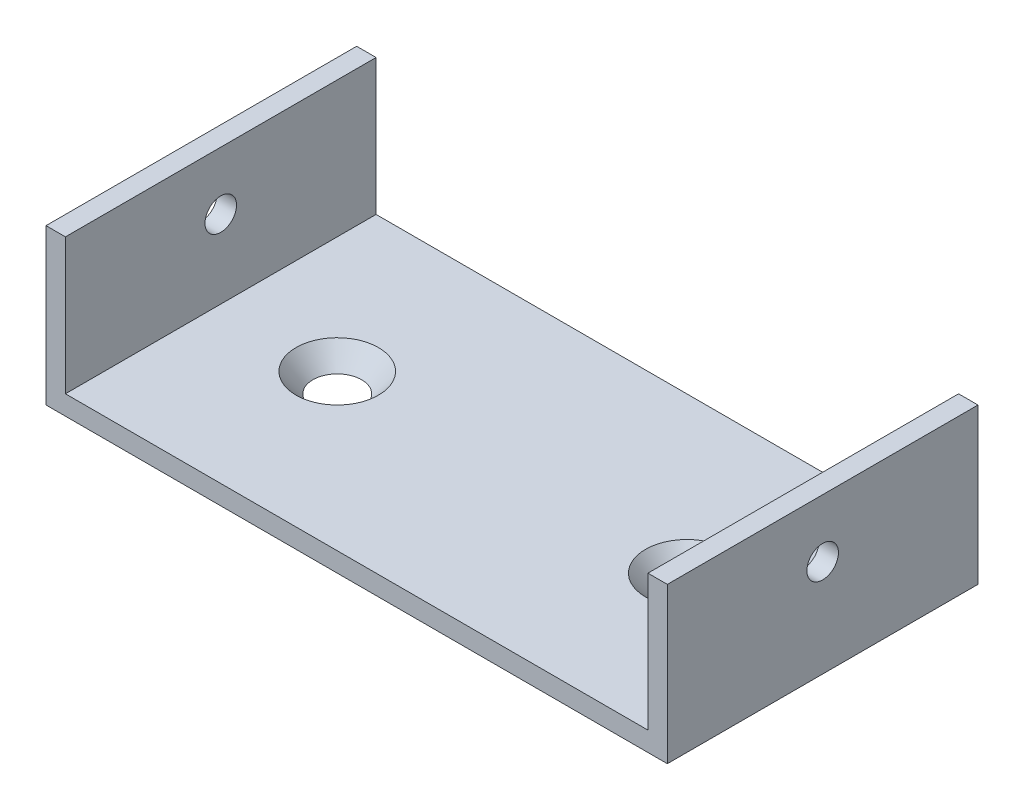
ISO-10303-21;
HEADER;
FILE_DESCRIPTION(('STEP AP214'),'2;1');
FILE_NAME('part.step','',(''),(''),'','','');
FILE_SCHEMA(('AUTOMOTIVE_DESIGN { 1 0 10303 214 1 1 1 1 }'));
ENDSEC;
DATA;
#1=APPLICATION_CONTEXT('core data for automotive mechanical design processes');
#2=APPLICATION_PROTOCOL_DEFINITION('international standard','automotive_design',2000,#1);
#3=PRODUCT_CONTEXT('',#1,'mechanical');
#4=PRODUCT('Part','Part','',(#3));
#5=PRODUCT_RELATED_PRODUCT_CATEGORY('part','',(#4));
#6=PRODUCT_DEFINITION_FORMATION('','',#4);
#7=PRODUCT_DEFINITION_CONTEXT('part definition',#1,'design');
#8=PRODUCT_DEFINITION('design','',#6,#7);
#9=PRODUCT_DEFINITION_SHAPE('','',#8);
#10=(LENGTH_UNIT() NAMED_UNIT(*) SI_UNIT(.MILLI.,.METRE.));
#11=(NAMED_UNIT(*) PLANE_ANGLE_UNIT() SI_UNIT($,.RADIAN.));
#12=(NAMED_UNIT(*) SI_UNIT($,.STERADIAN.) SOLID_ANGLE_UNIT());
#13=UNCERTAINTY_MEASURE_WITH_UNIT(LENGTH_MEASURE(1.E-05),#10,'distance_accuracy_value','');
#14=(GEOMETRIC_REPRESENTATION_CONTEXT(3) GLOBAL_UNCERTAINTY_ASSIGNED_CONTEXT((#13)) GLOBAL_UNIT_ASSIGNED_CONTEXT((#10,
#11,#12)) REPRESENTATION_CONTEXT('',''));
#15=CARTESIAN_POINT('',(0.,0.,0.));
#16=DIRECTION('',(0.,0.,1.));
#17=DIRECTION('',(1.,0.,0.));
#18=AXIS2_PLACEMENT_3D('',#15,#16,#17);
#19=CARTESIAN_POINT('',(-50.8,-12.7,25.4));
#20=DIRECTION('',(0.,1.,0.));
#21=DIRECTION('',(0.,0.,1.));
#22=AXIS2_PLACEMENT_3D('',#19,#20,#21);
#23=PLANE('',#22);
#24=CARTESIAN_POINT('',(-28.575,-12.7,0.));
#25=DIRECTION('',(0.,1.,0.));
#26=DIRECTION('',(0.,0.,1.));
#27=AXIS2_PLACEMENT_3D('',#24,#25,#26);
#28=CIRCLE('',#27,3.98371460743348);
#29=CARTESIAN_POINT('',(-28.575,-12.7,3.98371460743348));
#30=VERTEX_POINT('',#29);
#31=EDGE_CURVE('E47',#30,#30,#28,.T.);
#32=ORIENTED_EDGE('',*,*,#31,.T.);
#33=EDGE_LOOP('',(#32));
#34=FACE_BOUND('',#33,.T.);
#35=CARTESIAN_POINT('',(28.575,-12.7,0.));
#36=DIRECTION('',(0.,1.,0.));
#37=DIRECTION('',(0.,0.,1.));
#38=AXIS2_PLACEMENT_3D('',#35,#36,#37);
#39=CIRCLE('',#38,3.98371460743347);
#40=CARTESIAN_POINT('',(28.575,-12.7,3.98371460743348));
#41=VERTEX_POINT('',#40);
#42=EDGE_CURVE('E152',#41,#41,#39,.T.);
#43=ORIENTED_EDGE('',*,*,#42,.T.);
#44=EDGE_LOOP('',(#43));
#45=FACE_BOUND('',#44,.T.);
#46=DIRECTION('',(1.,0.,0.));
#47=VECTOR('',#46,1.);
#48=CARTESIAN_POINT('',(-50.8,-12.7,-25.4));
#49=LINE('',#48,#47);
#50=CARTESIAN_POINT('',(-50.8,-12.7,-25.4));
#51=VERTEX_POINT('',#50);
#52=CARTESIAN_POINT('',(50.8,-12.7,-25.4));
#53=VERTEX_POINT('',#52);
#54=EDGE_CURVE('E155',#51,#53,#49,.T.);
#55=ORIENTED_EDGE('',*,*,#54,.T.);
#56=DIRECTION('',(0.,0.,-1.));
#57=VECTOR('',#56,1.);
#58=CARTESIAN_POINT('',(50.8,-12.7,25.4));
#59=LINE('',#58,#57);
#60=CARTESIAN_POINT('',(50.8,-12.7,25.4));
#61=VERTEX_POINT('',#60);
#62=EDGE_CURVE('E181',#61,#53,#59,.T.);
#63=ORIENTED_EDGE('',*,*,#62,.F.);
#64=DIRECTION('',(1.,0.,0.));
#65=VECTOR('',#64,1.);
#66=CARTESIAN_POINT('',(-50.8,-12.7,25.4));
#67=LINE('',#66,#65);
#68=CARTESIAN_POINT('',(-50.8,-12.7,25.4));
#69=VERTEX_POINT('',#68);
#70=EDGE_CURVE('E207',#69,#61,#67,.T.);
#71=ORIENTED_EDGE('',*,*,#70,.F.);
#72=DIRECTION('',(0.,0.,-1.));
#73=VECTOR('',#72,1.);
#74=CARTESIAN_POINT('',(-50.8,-12.7,25.4));
#75=LINE('',#74,#73);
#76=EDGE_CURVE('E54',#69,#51,#75,.T.);
#77=ORIENTED_EDGE('',*,*,#76,.T.);
#78=EDGE_LOOP('',(#55,#63,#71,#77));
#79=FACE_BOUND('',#78,.T.);
#80=ADVANCED_FACE('F43',(#34,#45,#79),#23,.F.);
#81=CARTESIAN_POINT('',(-47.625,12.7,25.4));
#82=DIRECTION('',(0.,-1.,0.));
#83=DIRECTION('',(1.,0.,0.));
#84=AXIS2_PLACEMENT_3D('',#81,#82,#83);
#85=PLANE('',#84);
#86=DIRECTION('',(-1.,0.,0.));
#87=VECTOR('',#86,1.);
#88=CARTESIAN_POINT('',(-47.625,12.7,-25.4));
#89=LINE('',#88,#87);
#90=CARTESIAN_POINT('',(-47.625,12.7,-25.4));
#91=VERTEX_POINT('',#90);
#92=CARTESIAN_POINT('',(-50.8,12.7,-25.4));
#93=VERTEX_POINT('',#92);
#94=EDGE_CURVE('E147',#91,#93,#89,.T.);
#95=ORIENTED_EDGE('',*,*,#94,.T.);
#96=DIRECTION('',(0.,0.,-1.));
#97=VECTOR('',#96,1.);
#98=CARTESIAN_POINT('',(-50.8,12.7,25.4));
#99=LINE('',#98,#97);
#100=CARTESIAN_POINT('',(-50.8,12.7,25.4));
#101=VERTEX_POINT('',#100);
#102=EDGE_CURVE('E11',#101,#93,#99,.T.);
#103=ORIENTED_EDGE('',*,*,#102,.F.);
#104=DIRECTION('',(-1.,0.,0.));
#105=VECTOR('',#104,1.);
#106=CARTESIAN_POINT('',(-47.625,12.7,25.4));
#107=LINE('',#106,#105);
#108=CARTESIAN_POINT('',(-47.625,12.7,25.4));
#109=VERTEX_POINT('',#108);
#110=EDGE_CURVE('E170',#109,#101,#107,.T.);
#111=ORIENTED_EDGE('',*,*,#110,.F.);
#112=DIRECTION('',(0.,0.,-1.));
#113=VECTOR('',#112,1.);
#114=CARTESIAN_POINT('',(-47.625,12.7,25.4));
#115=LINE('',#114,#113);
#116=EDGE_CURVE('E143',#109,#91,#115,.T.);
#117=ORIENTED_EDGE('',*,*,#116,.T.);
#118=EDGE_LOOP('',(#95,#103,#111,#117));
#119=FACE_BOUND('',#118,.T.);
#120=ADVANCED_FACE('F45',(#119),#85,.F.);
#121=CARTESIAN_POINT('',(-50.8,12.7,25.4));
#122=DIRECTION('',(1.,0.,0.));
#123=DIRECTION('',(0.,0.,-1.));
#124=AXIS2_PLACEMENT_3D('',#121,#122,#123);
#125=PLANE('',#124);
#126=CARTESIAN_POINT('',(-50.8,3.21584337728158,0.));
#127=DIRECTION('',(1.,0.,0.));
#128=DIRECTION('',(0.,0.,-1.));
#129=AXIS2_PLACEMENT_3D('',#126,#127,#128);
#130=CIRCLE('',#129,2.57975099999998);
#131=CARTESIAN_POINT('',(-50.8,3.21584337728158,-2.57975099999998));
#132=VERTEX_POINT('',#131);
#133=EDGE_CURVE('E260',#132,#132,#130,.T.);
#134=ORIENTED_EDGE('',*,*,#133,.T.);
#135=EDGE_LOOP('',(#134));
#136=FACE_BOUND('',#135,.T.);
#137=DIRECTION('',(0.,-1.,0.));
#138=VECTOR('',#137,1.);
#139=CARTESIAN_POINT('',(-50.8,12.7,-25.4));
#140=LINE('',#139,#138);
#141=EDGE_CURVE('E151',#93,#51,#140,.T.);
#142=ORIENTED_EDGE('',*,*,#141,.T.);
#143=ORIENTED_EDGE('',*,*,#76,.F.);
#144=DIRECTION('',(0.,-1.,0.));
#145=VECTOR('',#144,1.);
#146=CARTESIAN_POINT('',(-50.8,12.7,25.4));
#147=LINE('',#146,#145);
#148=EDGE_CURVE('E106',#101,#69,#147,.T.);
#149=ORIENTED_EDGE('',*,*,#148,.F.);
#150=ORIENTED_EDGE('',*,*,#102,.T.);
#151=EDGE_LOOP('',(#142,#143,#149,#150));
#152=FACE_BOUND('',#151,.T.);
#153=ADVANCED_FACE('F249',(#136,#152),#125,.F.);
#154=CARTESIAN_POINT('',(50.8,-12.7,25.4));
#155=DIRECTION('',(-1.,0.,0.));
#156=DIRECTION('',(0.,0.,1.));
#157=AXIS2_PLACEMENT_3D('',#154,#155,#156);
#158=PLANE('',#157);
#159=CARTESIAN_POINT('',(50.8,3.21584337728158,0.));
#160=DIRECTION('',(1.,0.,0.));
#161=DIRECTION('',(0.,0.,-1.));
#162=AXIS2_PLACEMENT_3D('',#159,#160,#161);
#163=CIRCLE('',#162,2.57975099999999);
#164=CARTESIAN_POINT('',(50.8,3.21584337728158,-2.57975099999999));
#165=VERTEX_POINT('',#164);
#166=EDGE_CURVE('E265',#165,#165,#163,.T.);
#167=ORIENTED_EDGE('',*,*,#166,.F.);
#168=EDGE_LOOP('',(#167));
#169=FACE_BOUND('',#168,.T.);
#170=DIRECTION('',(0.,1.,0.));
#171=VECTOR('',#170,1.);
#172=CARTESIAN_POINT('',(50.8,-12.7,-25.4));
#173=LINE('',#172,#171);
#174=CARTESIAN_POINT('',(50.8,12.7,-25.4));
#175=VERTEX_POINT('',#174);
#176=EDGE_CURVE('E158',#53,#175,#173,.T.);
#177=ORIENTED_EDGE('',*,*,#176,.T.);
#178=DIRECTION('',(0.,0.,-1.));
#179=VECTOR('',#178,1.);
#180=CARTESIAN_POINT('',(50.8,12.7,25.4));
#181=LINE('',#180,#179);
#182=CARTESIAN_POINT('',(50.8,12.7,25.4));
#183=VERTEX_POINT('',#182);
#184=EDGE_CURVE('E177',#183,#175,#181,.T.);
#185=ORIENTED_EDGE('',*,*,#184,.F.);
#186=DIRECTION('',(0.,1.,0.));
#187=VECTOR('',#186,1.);
#188=CARTESIAN_POINT('',(50.8,-12.7,25.4));
#189=LINE('',#188,#187);
#190=EDGE_CURVE('E210',#61,#183,#189,.T.);
#191=ORIENTED_EDGE('',*,*,#190,.F.);
#192=ORIENTED_EDGE('',*,*,#62,.T.);
#193=EDGE_LOOP('',(#177,#185,#191,#192));
#194=FACE_BOUND('',#193,.T.);
#195=ADVANCED_FACE('F218',(#169,#194),#158,.F.);
#196=CARTESIAN_POINT('',(50.8,12.7,25.4));
#197=DIRECTION('',(0.,-1.,0.));
#198=DIRECTION('',(1.,0.,0.));
#199=AXIS2_PLACEMENT_3D('',#196,#197,#198);
#200=PLANE('',#199);
#201=DIRECTION('',(-1.,0.,0.));
#202=VECTOR('',#201,1.);
#203=CARTESIAN_POINT('',(50.8,12.7,-25.4));
#204=LINE('',#203,#202);
#205=CARTESIAN_POINT('',(47.625,12.7,-25.4));
#206=VERTEX_POINT('',#205);
#207=EDGE_CURVE('E161',#175,#206,#204,.T.);
#208=ORIENTED_EDGE('',*,*,#207,.T.);
#209=DIRECTION('',(0.,0.,-1.));
#210=VECTOR('',#209,1.);
#211=CARTESIAN_POINT('',(47.625,12.7,25.4));
#212=LINE('',#211,#210);
#213=CARTESIAN_POINT('',(47.625,12.7,25.4));
#214=VERTEX_POINT('',#213);
#215=EDGE_CURVE('E136',#214,#206,#212,.T.);
#216=ORIENTED_EDGE('',*,*,#215,.F.);
#217=DIRECTION('',(-1.,0.,0.));
#218=VECTOR('',#217,1.);
#219=CARTESIAN_POINT('',(50.8,12.7,25.4));
#220=LINE('',#219,#218);
#221=EDGE_CURVE('E125',#183,#214,#220,.T.);
#222=ORIENTED_EDGE('',*,*,#221,.F.);
#223=ORIENTED_EDGE('',*,*,#184,.T.);
#224=EDGE_LOOP('',(#208,#216,#222,#223));
#225=FACE_BOUND('',#224,.T.);
#226=ADVANCED_FACE('F222',(#225),#200,.F.);
#227=CARTESIAN_POINT('',(47.625,12.7,25.4));
#228=DIRECTION('',(1.,0.,0.));
#229=DIRECTION('',(0.,0.,-1.));
#230=AXIS2_PLACEMENT_3D('',#227,#228,#229);
#231=PLANE('',#230);
#232=CARTESIAN_POINT('',(47.625,3.21584337728158,0.));
#233=DIRECTION('',(1.,0.,0.));
#234=DIRECTION('',(0.,0.,-1.));
#235=AXIS2_PLACEMENT_3D('',#232,#233,#234);
#236=CIRCLE('',#235,2.57975099999998);
#237=CARTESIAN_POINT('',(47.625,3.21584337728158,-2.57975099999998));
#238=VERTEX_POINT('',#237);
#239=EDGE_CURVE('E269',#238,#238,#236,.T.);
#240=ORIENTED_EDGE('',*,*,#239,.T.);
#241=EDGE_LOOP('',(#240));
#242=FACE_BOUND('',#241,.T.);
#243=DIRECTION('',(0.,-1.,0.));
#244=VECTOR('',#243,1.);
#245=CARTESIAN_POINT('',(47.625,12.7,-25.4));
#246=LINE('',#245,#244);
#247=CARTESIAN_POINT('',(47.625,-9.525,-25.4));
#248=VERTEX_POINT('',#247);
#249=EDGE_CURVE('E134',#206,#248,#246,.T.);
#250=ORIENTED_EDGE('',*,*,#249,.T.);
#251=DIRECTION('',(0.,0.,-1.));
#252=VECTOR('',#251,1.);
#253=CARTESIAN_POINT('',(47.625,-9.525,25.4));
#254=LINE('',#253,#252);
#255=CARTESIAN_POINT('',(47.625,-9.525,25.4));
#256=VERTEX_POINT('',#255);
#257=EDGE_CURVE('E131',#256,#248,#254,.T.);
#258=ORIENTED_EDGE('',*,*,#257,.F.);
#259=DIRECTION('',(0.,-1.,0.));
#260=VECTOR('',#259,1.);
#261=CARTESIAN_POINT('',(47.625,12.7,25.4));
#262=LINE('',#261,#260);
#263=EDGE_CURVE('E119',#214,#256,#262,.T.);
#264=ORIENTED_EDGE('',*,*,#263,.F.);
#265=ORIENTED_EDGE('',*,*,#215,.T.);
#266=EDGE_LOOP('',(#250,#258,#264,#265));
#267=FACE_BOUND('',#266,.T.);
#268=ADVANCED_FACE('F132',(#242,#267),#231,.F.);
#269=CARTESIAN_POINT('',(47.625,-9.525,25.4));
#270=DIRECTION('',(0.,-1.,0.));
#271=DIRECTION('',(1.,0.,0.));
#272=AXIS2_PLACEMENT_3D('',#269,#270,#271);
#273=PLANE('',#272);
#274=CARTESIAN_POINT('',(-28.575,-9.52500000000001,0.));
#275=DIRECTION('',(0.,1.,0.));
#276=DIRECTION('',(0.,0.,1.));
#277=AXIS2_PLACEMENT_3D('',#274,#275,#276);
#278=CIRCLE('',#277,6.7437);
#279=CARTESIAN_POINT('',(-28.575,-9.52500000000001,6.7437));
#280=VERTEX_POINT('',#279);
#281=EDGE_CURVE('E199',#280,#280,#278,.T.);
#282=ORIENTED_EDGE('',*,*,#281,.F.);
#283=EDGE_LOOP('',(#282));
#284=FACE_BOUND('',#283,.T.);
#285=CARTESIAN_POINT('',(28.575,-9.525,0.));
#286=DIRECTION('',(0.,1.,0.));
#287=DIRECTION('',(0.,0.,1.));
#288=AXIS2_PLACEMENT_3D('',#285,#286,#287);
#289=CIRCLE('',#288,6.7437);
#290=CARTESIAN_POINT('',(28.575,-9.525,6.7437));
#291=VERTEX_POINT('',#290);
#292=EDGE_CURVE('E189',#291,#291,#289,.T.);
#293=ORIENTED_EDGE('',*,*,#292,.F.);
#294=EDGE_LOOP('',(#293));
#295=FACE_BOUND('',#294,.T.);
#296=DIRECTION('',(-1.,0.,0.));
#297=VECTOR('',#296,1.);
#298=CARTESIAN_POINT('',(47.625,-9.525,-25.4));
#299=LINE('',#298,#297);
#300=CARTESIAN_POINT('',(-47.625,-9.52500000000001,-25.4));
#301=VERTEX_POINT('',#300);
#302=EDGE_CURVE('E92',#248,#301,#299,.T.);
#303=ORIENTED_EDGE('',*,*,#302,.T.);
#304=DIRECTION('',(0.,0.,-1.));
#305=VECTOR('',#304,1.);
#306=CARTESIAN_POINT('',(-47.625,-9.52500000000001,25.4));
#307=LINE('',#306,#305);
#308=CARTESIAN_POINT('',(-47.625,-9.52500000000001,25.4));
#309=VERTEX_POINT('',#308);
#310=EDGE_CURVE('E137',#309,#301,#307,.T.);
#311=ORIENTED_EDGE('',*,*,#310,.F.);
#312=DIRECTION('',(-1.,0.,0.));
#313=VECTOR('',#312,1.);
#314=CARTESIAN_POINT('',(47.625,-9.525,25.4));
#315=LINE('',#314,#313);
#316=EDGE_CURVE('E123',#256,#309,#315,.T.);
#317=ORIENTED_EDGE('',*,*,#316,.F.);
#318=ORIENTED_EDGE('',*,*,#257,.T.);
#319=EDGE_LOOP('',(#303,#311,#317,#318));
#320=FACE_BOUND('',#319,.T.);
#321=ADVANCED_FACE('F139',(#284,#295,#320),#273,.F.);
#322=CARTESIAN_POINT('',(-47.625,-9.52500000000001,25.4));
#323=DIRECTION('',(-1.,0.,0.));
#324=DIRECTION('',(0.,0.,1.));
#325=AXIS2_PLACEMENT_3D('',#322,#323,#324);
#326=PLANE('',#325);
#327=CARTESIAN_POINT('',(-47.625,3.21584337728158,0.));
#328=DIRECTION('',(-1.,0.,0.));
#329=DIRECTION('',(0.,0.,1.));
#330=AXIS2_PLACEMENT_3D('',#327,#328,#329);
#331=CIRCLE('',#330,2.57975099999998);
#332=CARTESIAN_POINT('',(-47.625,3.21584337728158,2.57975099999998));
#333=VERTEX_POINT('',#332);
#334=EDGE_CURVE('E264',#333,#333,#331,.T.);
#335=ORIENTED_EDGE('',*,*,#334,.T.);
#336=EDGE_LOOP('',(#335));
#337=FACE_BOUND('',#336,.T.);
#338=DIRECTION('',(0.,1.,0.));
#339=VECTOR('',#338,1.);
#340=CARTESIAN_POINT('',(-47.625,-9.52500000000001,-25.4));
#341=LINE('',#340,#339);
#342=EDGE_CURVE('E98',#301,#91,#341,.T.);
#343=ORIENTED_EDGE('',*,*,#342,.T.);
#344=ORIENTED_EDGE('',*,*,#116,.F.);
#345=DIRECTION('',(0.,1.,0.));
#346=VECTOR('',#345,1.);
#347=CARTESIAN_POINT('',(-47.625,-9.52500000000001,25.4));
#348=LINE('',#347,#346);
#349=EDGE_CURVE('E63',#309,#109,#348,.T.);
#350=ORIENTED_EDGE('',*,*,#349,.F.);
#351=ORIENTED_EDGE('',*,*,#310,.T.);
#352=EDGE_LOOP('',(#343,#344,#350,#351));
#353=FACE_BOUND('',#352,.T.);
#354=ADVANCED_FACE('F230',(#337,#353),#326,.F.);
#355=CARTESIAN_POINT('',(0.,0.,25.4));
#356=DIRECTION('',(0.,0.,1.));
#357=DIRECTION('',(1.,0.,0.));
#358=AXIS2_PLACEMENT_3D('',#355,#356,#357);
#359=PLANE('',#358);
#360=ORIENTED_EDGE('',*,*,#110,.T.);
#361=ORIENTED_EDGE('',*,*,#148,.T.);
#362=ORIENTED_EDGE('',*,*,#70,.T.);
#363=ORIENTED_EDGE('',*,*,#190,.T.);
#364=ORIENTED_EDGE('',*,*,#221,.T.);
#365=ORIENTED_EDGE('',*,*,#263,.T.);
#366=ORIENTED_EDGE('',*,*,#316,.T.);
#367=ORIENTED_EDGE('',*,*,#349,.T.);
#368=EDGE_LOOP('',(#360,#361,#362,#363,#364,#365,#366,#367));
#369=FACE_BOUND('',#368,.T.);
#370=ADVANCED_FACE('F121',(#369),#359,.T.);
#371=CARTESIAN_POINT('',(0.,0.,-25.4));
#372=DIRECTION('',(0.,0.,1.));
#373=DIRECTION('',(1.,0.,0.));
#374=AXIS2_PLACEMENT_3D('',#371,#372,#373);
#375=PLANE('',#374);
#376=ORIENTED_EDGE('',*,*,#94,.F.);
#377=ORIENTED_EDGE('',*,*,#342,.F.);
#378=ORIENTED_EDGE('',*,*,#302,.F.);
#379=ORIENTED_EDGE('',*,*,#249,.F.);
#380=ORIENTED_EDGE('',*,*,#207,.F.);
#381=ORIENTED_EDGE('',*,*,#176,.F.);
#382=ORIENTED_EDGE('',*,*,#54,.F.);
#383=ORIENTED_EDGE('',*,*,#141,.F.);
#384=EDGE_LOOP('',(#376,#377,#378,#379,#380,#381,#382,#383));
#385=FACE_BOUND('',#384,.T.);
#386=ADVANCED_FACE('F225',(#385),#375,.F.);
#387=CARTESIAN_POINT('',(28.575,-9.525,0.));
#388=DIRECTION('',(0.,1.,0.));
#389=DIRECTION('',(0.,0.,1.));
#390=AXIS2_PLACEMENT_3D('',#387,#388,#389);
#391=CONICAL_SURFACE('',#390,6.7437,0.715584993317676);
#392=ORIENTED_EDGE('',*,*,#292,.T.);
#393=EDGE_LOOP('',(#392));
#394=FACE_BOUND('',#393,.T.);
#395=ORIENTED_EDGE('',*,*,#42,.F.);
#396=EDGE_LOOP('',(#395));
#397=FACE_BOUND('',#396,.T.);
#398=ADVANCED_FACE('F286',(#394,#397),#391,.F.);
#399=CARTESIAN_POINT('',(-28.575,-9.52500000000001,0.));
#400=DIRECTION('',(0.,1.,0.));
#401=DIRECTION('',(0.,0.,1.));
#402=AXIS2_PLACEMENT_3D('',#399,#400,#401);
#403=CONICAL_SURFACE('',#402,6.7437,0.715584993317676);
#404=ORIENTED_EDGE('',*,*,#281,.T.);
#405=EDGE_LOOP('',(#404));
#406=FACE_BOUND('',#405,.T.);
#407=ORIENTED_EDGE('',*,*,#31,.F.);
#408=EDGE_LOOP('',(#407));
#409=FACE_BOUND('',#408,.T.);
#410=ADVANCED_FACE('F281',(#406,#409),#403,.F.);
#411=CARTESIAN_POINT('',(50.8,3.21584337728158,0.));
#412=DIRECTION('',(1.,0.,0.));
#413=DIRECTION('',(0.,0.,-1.));
#414=AXIS2_PLACEMENT_3D('',#411,#412,#413);
#415=CYLINDRICAL_SURFACE('',#414,2.57975099999998);
#416=ORIENTED_EDGE('',*,*,#133,.F.);
#417=EDGE_LOOP('',(#416));
#418=FACE_BOUND('',#417,.T.);
#419=ORIENTED_EDGE('',*,*,#334,.F.);
#420=EDGE_LOOP('',(#419));
#421=FACE_BOUND('',#420,.T.);
#422=ADVANCED_FACE('F285',(#418,#421),#415,.F.);
#423=ORIENTED_EDGE('',*,*,#166,.T.);
#424=EDGE_LOOP('',(#423));
#425=FACE_BOUND('',#424,.T.);
#426=ORIENTED_EDGE('',*,*,#239,.F.);
#427=EDGE_LOOP('',(#426));
#428=FACE_BOUND('',#427,.T.);
#429=ADVANCED_FACE('F293',(#425,#428),#415,.F.);
#430=CLOSED_SHELL('',(#80,#120,#153,#195,#226,#268,#321,#354,#370,#386,#398,#410,#422,#429));
#431=MANIFOLD_SOLID_BREP('B2',#430);
#432=ADVANCED_BREP_SHAPE_REPRESENTATION('',(#18,#431),#14);
#433=SHAPE_DEFINITION_REPRESENTATION(#9,#432);
ENDSEC;
END-ISO-10303-21;
